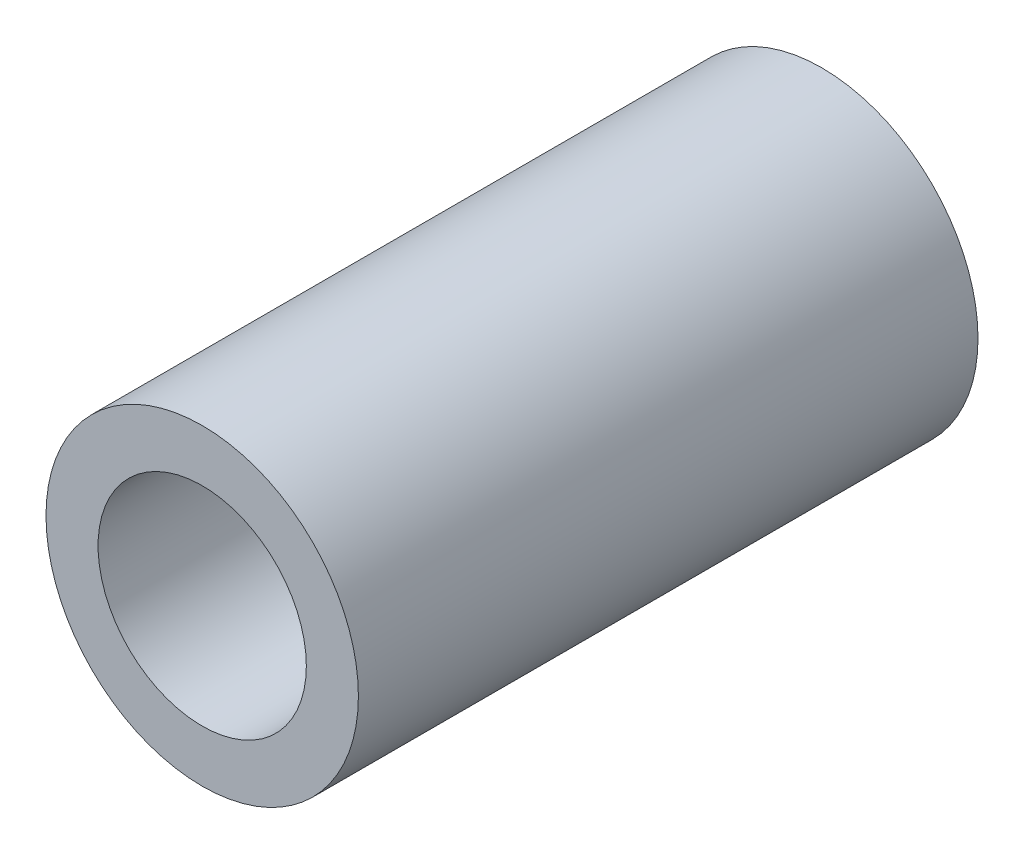
ISO-10303-21;
HEADER;
FILE_DESCRIPTION(('STEP AP214'),'2;1');
FILE_NAME('part.step','',(''),(''),'','','');
FILE_SCHEMA(('AUTOMOTIVE_DESIGN { 1 0 10303 214 1 1 1 1 }'));
ENDSEC;
DATA;
#1=APPLICATION_CONTEXT('core data for automotive mechanical design processes');
#2=APPLICATION_PROTOCOL_DEFINITION('international standard','automotive_design',2000,#1);
#3=PRODUCT_CONTEXT('',#1,'mechanical');
#4=PRODUCT('Part','Part','',(#3));
#5=PRODUCT_RELATED_PRODUCT_CATEGORY('part','',(#4));
#6=PRODUCT_DEFINITION_FORMATION('','',#4);
#7=PRODUCT_DEFINITION_CONTEXT('part definition',#1,'design');
#8=PRODUCT_DEFINITION('design','',#6,#7);
#9=PRODUCT_DEFINITION_SHAPE('','',#8);
#10=(LENGTH_UNIT() NAMED_UNIT(*) SI_UNIT(.MILLI.,.METRE.));
#11=(NAMED_UNIT(*) PLANE_ANGLE_UNIT() SI_UNIT($,.RADIAN.));
#12=(NAMED_UNIT(*) SI_UNIT($,.STERADIAN.) SOLID_ANGLE_UNIT());
#13=UNCERTAINTY_MEASURE_WITH_UNIT(LENGTH_MEASURE(1.E-05),#10,'distance_accuracy_value','');
#14=(GEOMETRIC_REPRESENTATION_CONTEXT(3) GLOBAL_UNCERTAINTY_ASSIGNED_CONTEXT((#13)) GLOBAL_UNIT_ASSIGNED_CONTEXT((#10,
#11,#12)) REPRESENTATION_CONTEXT('',''));
#15=CARTESIAN_POINT('',(0.,0.,0.));
#16=DIRECTION('',(0.,0.,1.));
#17=DIRECTION('',(1.,0.,0.));
#18=AXIS2_PLACEMENT_3D('',#15,#16,#17);
#19=CARTESIAN_POINT('',(0.,0.,11.9));
#20=DIRECTION('',(0.,0.,1.));
#21=DIRECTION('',(1.,0.,0.));
#22=AXIS2_PLACEMENT_3D('',#19,#20,#21);
#23=PLANE('',#22);
#24=CARTESIAN_POINT('',(0.,0.,11.9));
#25=DIRECTION('',(0.,0.,1.));
#26=DIRECTION('',(1.,0.,0.));
#27=AXIS2_PLACEMENT_3D('',#24,#25,#26);
#28=CIRCLE('',#27,3.);
#29=CARTESIAN_POINT('',(3.,0.,11.9));
#30=VERTEX_POINT('',#29);
#31=EDGE_CURVE('E10',#30,#30,#28,.T.);
#32=ORIENTED_EDGE('',*,*,#31,.T.);
#33=EDGE_LOOP('',(#32));
#34=FACE_BOUND('',#33,.T.);
#35=CARTESIAN_POINT('',(0.,0.,11.9));
#36=DIRECTION('',(0.,0.,1.));
#37=DIRECTION('',(1.,0.,0.));
#38=AXIS2_PLACEMENT_3D('',#35,#36,#37);
#39=CIRCLE('',#38,2.);
#40=CARTESIAN_POINT('',(2.,0.,11.9));
#41=VERTEX_POINT('',#40);
#42=EDGE_CURVE('E43',#41,#41,#39,.T.);
#43=ORIENTED_EDGE('',*,*,#42,.F.);
#44=EDGE_LOOP('',(#43));
#45=FACE_BOUND('',#44,.T.);
#46=ADVANCED_FACE('F32',(#34,#45),#23,.T.);
#47=CARTESIAN_POINT('',(0.,0.,0.));
#48=DIRECTION('',(0.,0.,1.));
#49=DIRECTION('',(1.,0.,0.));
#50=AXIS2_PLACEMENT_3D('',#47,#48,#49);
#51=PLANE('',#50);
#52=CARTESIAN_POINT('',(0.,0.,0.));
#53=DIRECTION('',(0.,0.,1.));
#54=DIRECTION('',(1.,0.,0.));
#55=AXIS2_PLACEMENT_3D('',#52,#53,#54);
#56=CIRCLE('',#55,3.);
#57=CARTESIAN_POINT('',(3.,0.,0.));
#58=VERTEX_POINT('',#57);
#59=EDGE_CURVE('E36',#58,#58,#56,.T.);
#60=ORIENTED_EDGE('',*,*,#59,.F.);
#61=EDGE_LOOP('',(#60));
#62=FACE_BOUND('',#61,.T.);
#63=CARTESIAN_POINT('',(0.,0.,0.));
#64=DIRECTION('',(0.,0.,1.));
#65=DIRECTION('',(1.,0.,0.));
#66=AXIS2_PLACEMENT_3D('',#63,#64,#65);
#67=CIRCLE('',#66,2.);
#68=CARTESIAN_POINT('',(2.,0.,0.));
#69=VERTEX_POINT('',#68);
#70=EDGE_CURVE('E45',#69,#69,#67,.T.);
#71=ORIENTED_EDGE('',*,*,#70,.T.);
#72=EDGE_LOOP('',(#71));
#73=FACE_BOUND('',#72,.T.);
#74=ADVANCED_FACE('F55',(#62,#73),#51,.F.);
#75=CARTESIAN_POINT('',(0.,0.,11.9));
#76=DIRECTION('',(0.,0.,-1.));
#77=DIRECTION('',(-1.,0.,0.));
#78=AXIS2_PLACEMENT_3D('',#75,#76,#77);
#79=CYLINDRICAL_SURFACE('',#78,3.);
#80=ORIENTED_EDGE('',*,*,#31,.F.);
#81=EDGE_LOOP('',(#80));
#82=FACE_BOUND('',#81,.T.);
#83=ORIENTED_EDGE('',*,*,#59,.T.);
#84=EDGE_LOOP('',(#83));
#85=FACE_BOUND('',#84,.T.);
#86=ADVANCED_FACE('F34',(#82,#85),#79,.T.);
#87=CARTESIAN_POINT('',(0.,0.,11.9));
#88=DIRECTION('',(0.,0.,-1.));
#89=DIRECTION('',(-1.,0.,0.));
#90=AXIS2_PLACEMENT_3D('',#87,#88,#89);
#91=CYLINDRICAL_SURFACE('',#90,2.);
#92=ORIENTED_EDGE('',*,*,#42,.T.);
#93=EDGE_LOOP('',(#92));
#94=FACE_BOUND('',#93,.T.);
#95=ORIENTED_EDGE('',*,*,#70,.F.);
#96=EDGE_LOOP('',(#95));
#97=FACE_BOUND('',#96,.T.);
#98=ADVANCED_FACE('F51',(#94,#97),#91,.F.);
#99=CLOSED_SHELL('',(#46,#74,#86,#98));
#100=MANIFOLD_SOLID_BREP('B2',#99);
#101=ADVANCED_BREP_SHAPE_REPRESENTATION('',(#18,#100),#14);
#102=SHAPE_DEFINITION_REPRESENTATION(#9,#101);
ENDSEC;
END-ISO-10303-21;
